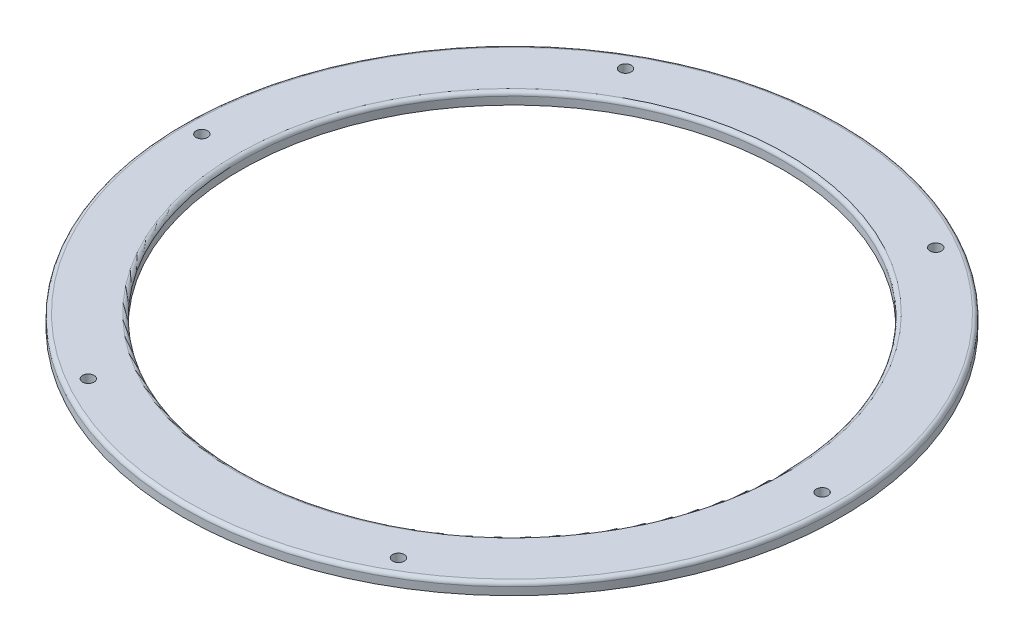
ISO-10303-21;
HEADER;
FILE_DESCRIPTION(('STEP AP214'),'2;1');
FILE_NAME('part.step','',(''),(''),'','','');
FILE_SCHEMA(('AUTOMOTIVE_DESIGN { 1 0 10303 214 1 1 1 1 }'));
ENDSEC;
DATA;
#1=APPLICATION_CONTEXT('core data for automotive mechanical design processes');
#2=APPLICATION_PROTOCOL_DEFINITION('international standard','automotive_design',2000,#1);
#3=PRODUCT_CONTEXT('',#1,'mechanical');
#4=PRODUCT('Part','Part','',(#3));
#5=PRODUCT_RELATED_PRODUCT_CATEGORY('part','',(#4));
#6=PRODUCT_DEFINITION_FORMATION('','',#4);
#7=PRODUCT_DEFINITION_CONTEXT('part definition',#1,'design');
#8=PRODUCT_DEFINITION('design','',#6,#7);
#9=PRODUCT_DEFINITION_SHAPE('','',#8);
#10=(LENGTH_UNIT() NAMED_UNIT(*) SI_UNIT(.MILLI.,.METRE.));
#11=(NAMED_UNIT(*) PLANE_ANGLE_UNIT() SI_UNIT($,.RADIAN.));
#12=(NAMED_UNIT(*) SI_UNIT($,.STERADIAN.) SOLID_ANGLE_UNIT());
#13=UNCERTAINTY_MEASURE_WITH_UNIT(LENGTH_MEASURE(1.E-05),#10,'distance_accuracy_value','');
#14=(GEOMETRIC_REPRESENTATION_CONTEXT(3) GLOBAL_UNCERTAINTY_ASSIGNED_CONTEXT((#13)) GLOBAL_UNIT_ASSIGNED_CONTEXT((#10,
#11,#12)) REPRESENTATION_CONTEXT('',''));
#15=CARTESIAN_POINT('',(0.,0.,0.));
#16=DIRECTION('',(0.,0.,1.));
#17=DIRECTION('',(1.,0.,0.));
#18=AXIS2_PLACEMENT_3D('',#15,#16,#17);
#19=CARTESIAN_POINT('',(0.,3.,0.));
#20=DIRECTION('',(0.,-1.,0.));
#21=DIRECTION('',(0.,0.,-1.));
#22=AXIS2_PLACEMENT_3D('',#19,#20,#21);
#23=CYLINDRICAL_SURFACE('',#22,85.);
#24=CARTESIAN_POINT('',(0.,2.,0.));
#25=DIRECTION('',(0.,1.,0.));
#26=DIRECTION('',(0.,0.,1.));
#27=AXIS2_PLACEMENT_3D('',#24,#25,#26);
#28=CIRCLE('',#27,85.);
#29=CARTESIAN_POINT('',(0.,2.,85.));
#30=VERTEX_POINT('',#29);
#31=EDGE_CURVE('E42',#30,#30,#28,.F.);
#32=ORIENTED_EDGE('',*,*,#31,.T.);
#33=EDGE_LOOP('',(#32));
#34=FACE_BOUND('',#33,.T.);
#35=CARTESIAN_POINT('',(0.,0.,0.));
#36=DIRECTION('',(0.,1.,0.));
#37=DIRECTION('',(0.,0.,1.));
#38=AXIS2_PLACEMENT_3D('',#35,#36,#37);
#39=CIRCLE('',#38,85.);
#40=CARTESIAN_POINT('',(0.,0.,85.));
#41=VERTEX_POINT('',#40);
#42=EDGE_CURVE('E55',#41,#41,#39,.T.);
#43=ORIENTED_EDGE('',*,*,#42,.T.);
#44=EDGE_LOOP('',(#43));
#45=FACE_BOUND('',#44,.T.);
#46=ADVANCED_FACE('F35',(#34,#45),#23,.T.);
#47=CARTESIAN_POINT('',(0.,3.,0.));
#48=DIRECTION('',(0.,1.,0.));
#49=DIRECTION('',(0.,0.,1.));
#50=AXIS2_PLACEMENT_3D('',#47,#48,#49);
#51=PLANE('',#50);
#52=CARTESIAN_POINT('',(0.,3.,0.));
#53=DIRECTION('',(0.,1.,0.));
#54=DIRECTION('',(0.,0.,1.));
#55=AXIS2_PLACEMENT_3D('',#52,#53,#54);
#56=CIRCLE('',#55,84.);
#57=CARTESIAN_POINT('',(0.,3.,84.));
#58=VERTEX_POINT('',#57);
#59=EDGE_CURVE('E46',#58,#58,#56,.T.);
#60=ORIENTED_EDGE('',*,*,#59,.T.);
#61=EDGE_LOOP('',(#60));
#62=FACE_BOUND('',#61,.T.);
#63=CARTESIAN_POINT('',(0.,3.,0.));
#64=DIRECTION('',(0.,1.,0.));
#65=DIRECTION('',(0.,0.,1.));
#66=AXIS2_PLACEMENT_3D('',#63,#64,#65);
#67=CIRCLE('',#66,71.);
#68=CARTESIAN_POINT('',(0.,3.,71.));
#69=VERTEX_POINT('',#68);
#70=EDGE_CURVE('E50',#69,#69,#67,.F.);
#71=ORIENTED_EDGE('',*,*,#70,.T.);
#72=EDGE_LOOP('',(#71));
#73=FACE_BOUND('',#72,.T.);
#74=CARTESIAN_POINT('',(40.0000000000008,3.,-69.2820323027546));
#75=DIRECTION('',(0.,1.,0.));
#76=DIRECTION('',(0.866025403784433,0.,0.50000000000001));
#77=AXIS2_PLACEMENT_3D('',#74,#75,#76);
#78=CIRCLE('',#77,1.5);
#79=CARTESIAN_POINT('',(41.2990381056775,3.,-68.5320323027546));
#80=VERTEX_POINT('',#79);
#81=EDGE_CURVE('E74',#80,#80,#78,.T.);
#82=ORIENTED_EDGE('',*,*,#81,.F.);
#83=EDGE_LOOP('',(#82));
#84=FACE_BOUND('',#83,.T.);
#85=CARTESIAN_POINT('',(-39.9999999999994,3.,-69.2820323027555));
#86=DIRECTION('',(0.,1.,0.));
#87=DIRECTION('',(0.866025403784443,0.,-0.499999999999992));
#88=AXIS2_PLACEMENT_3D('',#85,#86,#87);
#89=CIRCLE('',#88,1.5);
#90=CARTESIAN_POINT('',(-38.7009618943227,3.,-70.0320323027555));
#91=VERTEX_POINT('',#90);
#92=EDGE_CURVE('E80',#91,#91,#89,.T.);
#93=ORIENTED_EDGE('',*,*,#92,.F.);
#94=EDGE_LOOP('',(#93));
#95=FACE_BOUND('',#94,.T.);
#96=CARTESIAN_POINT('',(-80.,3.,0.));
#97=DIRECTION('',(0.,1.,0.));
#98=DIRECTION('',(0.,0.,-1.));
#99=AXIS2_PLACEMENT_3D('',#96,#97,#98);
#100=CIRCLE('',#99,1.5);
#101=CARTESIAN_POINT('',(-80.,3.,-1.5));
#102=VERTEX_POINT('',#101);
#103=EDGE_CURVE('E86',#102,#102,#100,.T.);
#104=ORIENTED_EDGE('',*,*,#103,.F.);
#105=EDGE_LOOP('',(#104));
#106=FACE_BOUND('',#105,.T.);
#107=CARTESIAN_POINT('',(-40.0000000000003,3.,69.2820323027549));
#108=DIRECTION('',(0.,1.,0.));
#109=DIRECTION('',(-0.866025403784436,0.,-0.500000000000004));
#110=AXIS2_PLACEMENT_3D('',#107,#108,#109);
#111=CIRCLE('',#110,1.5);
#112=CARTESIAN_POINT('',(-41.299038105677,3.,68.5320323027549));
#113=VERTEX_POINT('',#112);
#114=EDGE_CURVE('E92',#113,#113,#111,.T.);
#115=ORIENTED_EDGE('',*,*,#114,.F.);
#116=EDGE_LOOP('',(#115));
#117=FACE_BOUND('',#116,.T.);
#118=CARTESIAN_POINT('',(39.9999999999998,3.,69.2820323027552));
#119=DIRECTION('',(0.,1.,0.));
#120=DIRECTION('',(-0.86602540378444,0.,0.499999999999998));
#121=AXIS2_PLACEMENT_3D('',#118,#119,#120);
#122=CIRCLE('',#121,1.5);
#123=CARTESIAN_POINT('',(38.7009618943232,3.,70.0320323027552));
#124=VERTEX_POINT('',#123);
#125=EDGE_CURVE('E68',#124,#124,#122,.T.);
#126=ORIENTED_EDGE('',*,*,#125,.F.);
#127=EDGE_LOOP('',(#126));
#128=FACE_BOUND('',#127,.T.);
#129=CARTESIAN_POINT('',(80.,3.,0.));
#130=DIRECTION('',(0.,1.,0.));
#131=DIRECTION('',(0.,0.,1.));
#132=AXIS2_PLACEMENT_3D('',#129,#130,#131);
#133=CIRCLE('',#132,1.5);
#134=CARTESIAN_POINT('',(80.,3.,1.5));
#135=VERTEX_POINT('',#134);
#136=EDGE_CURVE('E62',#135,#135,#133,.T.);
#137=ORIENTED_EDGE('',*,*,#136,.F.);
#138=EDGE_LOOP('',(#137));
#139=FACE_BOUND('',#138,.T.);
#140=ADVANCED_FACE('F109',(#62,#73,#84,#95,#106,#117,#128,#139),#51,.T.);
#141=CARTESIAN_POINT('',(0.,0.,0.));
#142=DIRECTION('',(0.,1.,0.));
#143=DIRECTION('',(0.,0.,1.));
#144=AXIS2_PLACEMENT_3D('',#141,#142,#143);
#145=PLANE('',#144);
#146=CARTESIAN_POINT('',(40.0000000000008,0.,-69.2820323027546));
#147=DIRECTION('',(0.,1.,0.));
#148=DIRECTION('',(0.866025403784433,0.,0.50000000000001));
#149=AXIS2_PLACEMENT_3D('',#146,#147,#148);
#150=CIRCLE('',#149,1.5);
#151=CARTESIAN_POINT('',(41.2990381056775,0.,-68.5320323027546));
#152=VERTEX_POINT('',#151);
#153=EDGE_CURVE('E77',#152,#152,#150,.T.);
#154=ORIENTED_EDGE('',*,*,#153,.T.);
#155=EDGE_LOOP('',(#154));
#156=FACE_BOUND('',#155,.T.);
#157=CARTESIAN_POINT('',(-39.9999999999994,0.,-69.2820323027555));
#158=DIRECTION('',(0.,1.,0.));
#159=DIRECTION('',(0.866025403784443,0.,-0.499999999999992));
#160=AXIS2_PLACEMENT_3D('',#157,#158,#159);
#161=CIRCLE('',#160,1.5);
#162=CARTESIAN_POINT('',(-38.7009618943227,0.,-70.0320323027555));
#163=VERTEX_POINT('',#162);
#164=EDGE_CURVE('E83',#163,#163,#161,.T.);
#165=ORIENTED_EDGE('',*,*,#164,.T.);
#166=EDGE_LOOP('',(#165));
#167=FACE_BOUND('',#166,.T.);
#168=CARTESIAN_POINT('',(-80.,0.,0.));
#169=DIRECTION('',(0.,1.,0.));
#170=DIRECTION('',(0.,0.,-1.));
#171=AXIS2_PLACEMENT_3D('',#168,#169,#170);
#172=CIRCLE('',#171,1.5);
#173=CARTESIAN_POINT('',(-80.,0.,-1.5));
#174=VERTEX_POINT('',#173);
#175=EDGE_CURVE('E89',#174,#174,#172,.T.);
#176=ORIENTED_EDGE('',*,*,#175,.T.);
#177=EDGE_LOOP('',(#176));
#178=FACE_BOUND('',#177,.T.);
#179=CARTESIAN_POINT('',(-40.0000000000003,0.,69.2820323027549));
#180=DIRECTION('',(0.,1.,0.));
#181=DIRECTION('',(-0.866025403784436,0.,-0.500000000000004));
#182=AXIS2_PLACEMENT_3D('',#179,#180,#181);
#183=CIRCLE('',#182,1.5);
#184=CARTESIAN_POINT('',(-41.299038105677,0.,68.5320323027549));
#185=VERTEX_POINT('',#184);
#186=EDGE_CURVE('E71',#185,#185,#183,.T.);
#187=ORIENTED_EDGE('',*,*,#186,.T.);
#188=EDGE_LOOP('',(#187));
#189=FACE_BOUND('',#188,.T.);
#190=CARTESIAN_POINT('',(39.9999999999998,0.,69.2820323027552));
#191=DIRECTION('',(0.,1.,0.));
#192=DIRECTION('',(-0.86602540378444,0.,0.499999999999998));
#193=AXIS2_PLACEMENT_3D('',#190,#191,#192);
#194=CIRCLE('',#193,1.5);
#195=CARTESIAN_POINT('',(38.7009618943232,0.,70.0320323027552));
#196=VERTEX_POINT('',#195);
#197=EDGE_CURVE('E65',#196,#196,#194,.T.);
#198=ORIENTED_EDGE('',*,*,#197,.T.);
#199=EDGE_LOOP('',(#198));
#200=FACE_BOUND('',#199,.T.);
#201=CARTESIAN_POINT('',(80.,0.,0.));
#202=DIRECTION('',(0.,1.,0.));
#203=DIRECTION('',(0.,0.,1.));
#204=AXIS2_PLACEMENT_3D('',#201,#202,#203);
#205=CIRCLE('',#204,1.5);
#206=CARTESIAN_POINT('',(80.,0.,1.5));
#207=VERTEX_POINT('',#206);
#208=EDGE_CURVE('E61',#207,#207,#205,.T.);
#209=ORIENTED_EDGE('',*,*,#208,.T.);
#210=EDGE_LOOP('',(#209));
#211=FACE_BOUND('',#210,.T.);
#212=CARTESIAN_POINT('',(0.,0.,0.));
#213=DIRECTION('',(0.,1.,0.));
#214=DIRECTION('',(0.,0.,1.));
#215=AXIS2_PLACEMENT_3D('',#212,#213,#214);
#216=CIRCLE('',#215,70.);
#217=CARTESIAN_POINT('',(0.,0.,70.));
#218=VERTEX_POINT('',#217);
#219=EDGE_CURVE('E58',#218,#218,#216,.T.);
#220=ORIENTED_EDGE('',*,*,#219,.T.);
#221=EDGE_LOOP('',(#220));
#222=FACE_BOUND('',#221,.T.);
#223=ORIENTED_EDGE('',*,*,#42,.F.);
#224=EDGE_LOOP('',(#223));
#225=FACE_BOUND('',#224,.T.);
#226=ADVANCED_FACE('F98',(#156,#167,#178,#189,#200,#211,#222,#225),#145,.F.);
#227=CARTESIAN_POINT('',(0.,0.,0.));
#228=DIRECTION('',(0.,1.,0.));
#229=DIRECTION('',(0.,0.,1.));
#230=AXIS2_PLACEMENT_3D('',#227,#228,#229);
#231=CYLINDRICAL_SURFACE('',#230,70.);
#232=CARTESIAN_POINT('',(0.,2.,0.));
#233=DIRECTION('',(0.,1.,0.));
#234=DIRECTION('',(0.,0.,1.));
#235=AXIS2_PLACEMENT_3D('',#232,#233,#234);
#236=CIRCLE('',#235,70.);
#237=CARTESIAN_POINT('',(0.,2.,70.));
#238=VERTEX_POINT('',#237);
#239=EDGE_CURVE('E10',#238,#238,#236,.T.);
#240=ORIENTED_EDGE('',*,*,#239,.T.);
#241=EDGE_LOOP('',(#240));
#242=FACE_BOUND('',#241,.T.);
#243=ORIENTED_EDGE('',*,*,#219,.F.);
#244=EDGE_LOOP('',(#243));
#245=FACE_BOUND('',#244,.T.);
#246=ADVANCED_FACE('F120',(#242,#245),#231,.F.);
#247=CARTESIAN_POINT('',(80.,0.,0.));
#248=DIRECTION('',(0.,1.,0.));
#249=DIRECTION('',(0.,0.,1.));
#250=AXIS2_PLACEMENT_3D('',#247,#248,#249);
#251=CYLINDRICAL_SURFACE('',#250,1.5);
#252=ORIENTED_EDGE('',*,*,#208,.F.);
#253=EDGE_LOOP('',(#252));
#254=FACE_BOUND('',#253,.T.);
#255=ORIENTED_EDGE('',*,*,#136,.T.);
#256=EDGE_LOOP('',(#255));
#257=FACE_BOUND('',#256,.T.);
#258=ADVANCED_FACE('F118',(#254,#257),#251,.F.);
#259=CARTESIAN_POINT('',(39.9999999999998,0.,69.2820323027552));
#260=DIRECTION('',(0.,1.,0.));
#261=DIRECTION('',(0.,0.,1.));
#262=AXIS2_PLACEMENT_3D('',#259,#260,#261);
#263=CYLINDRICAL_SURFACE('',#262,1.5);
#264=ORIENTED_EDGE('',*,*,#197,.F.);
#265=EDGE_LOOP('',(#264));
#266=FACE_BOUND('',#265,.T.);
#267=ORIENTED_EDGE('',*,*,#125,.T.);
#268=EDGE_LOOP('',(#267));
#269=FACE_BOUND('',#268,.T.);
#270=ADVANCED_FACE('F105',(#266,#269),#263,.F.);
#271=CARTESIAN_POINT('',(-40.0000000000003,0.,69.2820323027549));
#272=DIRECTION('',(0.,1.,0.));
#273=DIRECTION('',(0.,0.,1.));
#274=AXIS2_PLACEMENT_3D('',#271,#272,#273);
#275=CYLINDRICAL_SURFACE('',#274,1.5);
#276=ORIENTED_EDGE('',*,*,#186,.F.);
#277=EDGE_LOOP('',(#276));
#278=FACE_BOUND('',#277,.T.);
#279=ORIENTED_EDGE('',*,*,#114,.T.);
#280=EDGE_LOOP('',(#279));
#281=FACE_BOUND('',#280,.T.);
#282=ADVANCED_FACE('F101',(#278,#281),#275,.F.);
#283=CARTESIAN_POINT('',(-80.,0.,0.));
#284=DIRECTION('',(0.,1.,0.));
#285=DIRECTION('',(0.,0.,1.));
#286=AXIS2_PLACEMENT_3D('',#283,#284,#285);
#287=CYLINDRICAL_SURFACE('',#286,1.5);
#288=ORIENTED_EDGE('',*,*,#175,.F.);
#289=EDGE_LOOP('',(#288));
#290=FACE_BOUND('',#289,.T.);
#291=ORIENTED_EDGE('',*,*,#103,.T.);
#292=EDGE_LOOP('',(#291));
#293=FACE_BOUND('',#292,.T.);
#294=ADVANCED_FACE('F104',(#290,#293),#287,.F.);
#295=CARTESIAN_POINT('',(-39.9999999999994,0.,-69.2820323027555));
#296=DIRECTION('',(0.,1.,0.));
#297=DIRECTION('',(0.,0.,1.));
#298=AXIS2_PLACEMENT_3D('',#295,#296,#297);
#299=CYLINDRICAL_SURFACE('',#298,1.5);
#300=ORIENTED_EDGE('',*,*,#164,.F.);
#301=EDGE_LOOP('',(#300));
#302=FACE_BOUND('',#301,.T.);
#303=ORIENTED_EDGE('',*,*,#92,.T.);
#304=EDGE_LOOP('',(#303));
#305=FACE_BOUND('',#304,.T.);
#306=ADVANCED_FACE('F146',(#302,#305),#299,.F.);
#307=CARTESIAN_POINT('',(40.0000000000008,0.,-69.2820323027546));
#308=DIRECTION('',(0.,1.,0.));
#309=DIRECTION('',(0.,0.,1.));
#310=AXIS2_PLACEMENT_3D('',#307,#308,#309);
#311=CYLINDRICAL_SURFACE('',#310,1.5);
#312=ORIENTED_EDGE('',*,*,#153,.F.);
#313=EDGE_LOOP('',(#312));
#314=FACE_BOUND('',#313,.T.);
#315=ORIENTED_EDGE('',*,*,#81,.T.);
#316=EDGE_LOOP('',(#315));
#317=FACE_BOUND('',#316,.T.);
#318=ADVANCED_FACE('F139',(#314,#317),#311,.F.);
#319=CARTESIAN_POINT('',(0.,2.,0.));
#320=DIRECTION('',(0.,1.,0.));
#321=DIRECTION('',(0.,0.,1.));
#322=AXIS2_PLACEMENT_3D('',#319,#320,#321);
#323=TOROIDAL_SURFACE('',#322,84.,1.);
#324=ORIENTED_EDGE('',*,*,#31,.F.);
#325=EDGE_LOOP('',(#324));
#326=FACE_BOUND('',#325,.T.);
#327=ORIENTED_EDGE('',*,*,#59,.F.);
#328=EDGE_LOOP('',(#327));
#329=FACE_BOUND('',#328,.T.);
#330=ADVANCED_FACE('F137',(#326,#329),#323,.T.);
#331=CARTESIAN_POINT('',(0.,2.,0.));
#332=DIRECTION('',(0.,1.,0.));
#333=DIRECTION('',(0.,0.,1.));
#334=AXIS2_PLACEMENT_3D('',#331,#332,#333);
#335=TOROIDAL_SURFACE('',#334,71.,1.);
#336=ORIENTED_EDGE('',*,*,#70,.F.);
#337=EDGE_LOOP('',(#336));
#338=FACE_BOUND('',#337,.T.);
#339=ORIENTED_EDGE('',*,*,#239,.F.);
#340=EDGE_LOOP('',(#339));
#341=FACE_BOUND('',#340,.T.);
#342=ADVANCED_FACE('F37',(#338,#341),#335,.T.);
#343=CLOSED_SHELL('',(#46,#140,#226,#246,#258,#270,#282,#294,#306,#318,#330,#342));
#344=MANIFOLD_SOLID_BREP('B2',#343);
#345=ADVANCED_BREP_SHAPE_REPRESENTATION('',(#18,#344),#14);
#346=SHAPE_DEFINITION_REPRESENTATION(#9,#345);
ENDSEC;
END-ISO-10303-21;
